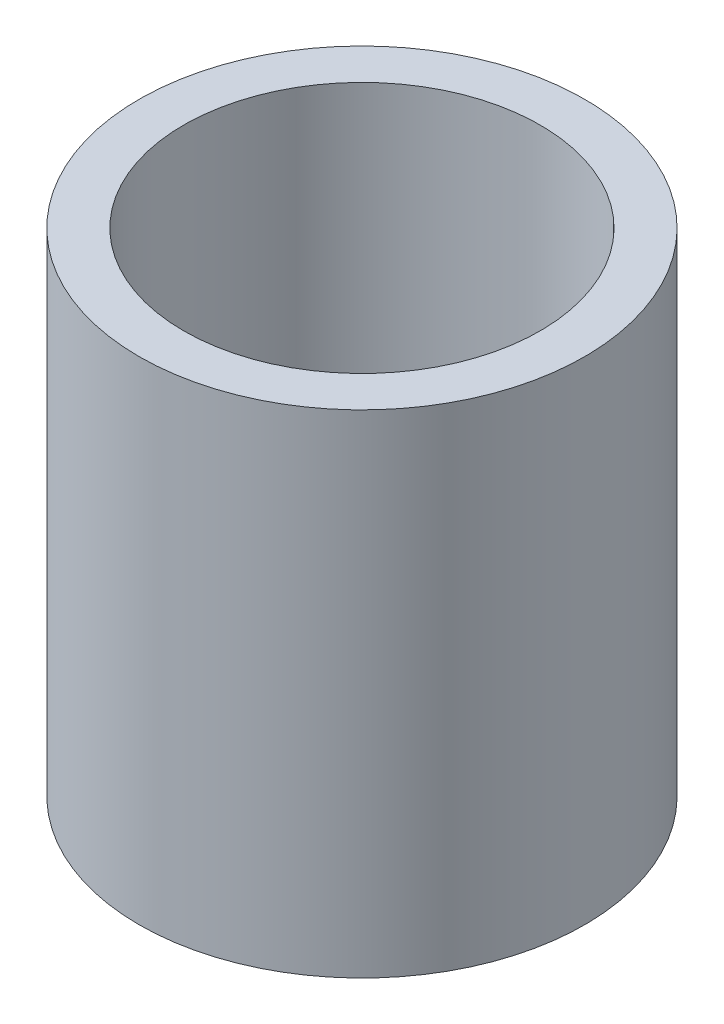
ISO-10303-21;
HEADER;
FILE_DESCRIPTION(('STEP AP214'),'2;1');
FILE_NAME('part.step','',(''),(''),'','','');
FILE_SCHEMA(('AUTOMOTIVE_DESIGN { 1 0 10303 214 1 1 1 1 }'));
ENDSEC;
DATA;
#1=APPLICATION_CONTEXT('core data for automotive mechanical design processes');
#2=APPLICATION_PROTOCOL_DEFINITION('international standard','automotive_design',2000,#1);
#3=PRODUCT_CONTEXT('',#1,'mechanical');
#4=PRODUCT('Part','Part','',(#3));
#5=PRODUCT_RELATED_PRODUCT_CATEGORY('part','',(#4));
#6=PRODUCT_DEFINITION_FORMATION('','',#4);
#7=PRODUCT_DEFINITION_CONTEXT('part definition',#1,'design');
#8=PRODUCT_DEFINITION('design','',#6,#7);
#9=PRODUCT_DEFINITION_SHAPE('','',#8);
#10=(LENGTH_UNIT() NAMED_UNIT(*) SI_UNIT(.MILLI.,.METRE.));
#11=(NAMED_UNIT(*) PLANE_ANGLE_UNIT() SI_UNIT($,.RADIAN.));
#12=(NAMED_UNIT(*) SI_UNIT($,.STERADIAN.) SOLID_ANGLE_UNIT());
#13=UNCERTAINTY_MEASURE_WITH_UNIT(LENGTH_MEASURE(1.E-05),#10,'distance_accuracy_value','');
#14=(GEOMETRIC_REPRESENTATION_CONTEXT(3) GLOBAL_UNCERTAINTY_ASSIGNED_CONTEXT((#13)) GLOBAL_UNIT_ASSIGNED_CONTEXT((#10,
#11,#12)) REPRESENTATION_CONTEXT('',''));
#15=CARTESIAN_POINT('',(0.,0.,0.));
#16=DIRECTION('',(0.,0.,1.));
#17=DIRECTION('',(1.,0.,0.));
#18=AXIS2_PLACEMENT_3D('',#15,#16,#17);
#19=CARTESIAN_POINT('',(0.,0.69,0.));
#20=DIRECTION('',(0.,1.,0.));
#21=DIRECTION('',(0.,0.,1.));
#22=AXIS2_PLACEMENT_3D('',#19,#20,#21);
#23=PLANE('',#22);
#24=CARTESIAN_POINT('',(0.,0.69,0.));
#25=DIRECTION('',(0.,1.,0.));
#26=DIRECTION('',(0.,0.,1.));
#27=AXIS2_PLACEMENT_3D('',#24,#25,#26);
#28=CIRCLE('',#27,0.625000000000001);
#29=CARTESIAN_POINT('',(0.,0.69,0.625000000000001));
#30=VERTEX_POINT('',#29);
#31=EDGE_CURVE('E10',#30,#30,#28,.T.);
#32=ORIENTED_EDGE('',*,*,#31,.T.);
#33=EDGE_LOOP('',(#32));
#34=FACE_BOUND('',#33,.T.);
#35=CARTESIAN_POINT('',(0.,0.69,0.));
#36=DIRECTION('',(0.,1.,0.));
#37=DIRECTION('',(0.,0.,1.));
#38=AXIS2_PLACEMENT_3D('',#35,#36,#37);
#39=CIRCLE('',#38,0.5);
#40=CARTESIAN_POINT('',(0.,0.69,0.5));
#41=VERTEX_POINT('',#40);
#42=EDGE_CURVE('E56',#41,#41,#39,.T.);
#43=ORIENTED_EDGE('',*,*,#42,.F.);
#44=EDGE_LOOP('',(#43));
#45=FACE_BOUND('',#44,.T.);
#46=ADVANCED_FACE('F43',(#34,#45),#23,.T.);
#47=CARTESIAN_POINT('',(0.,-0.69,0.));
#48=DIRECTION('',(0.,1.,0.));
#49=DIRECTION('',(0.,0.,1.));
#50=AXIS2_PLACEMENT_3D('',#47,#48,#49);
#51=PLANE('',#50);
#52=CARTESIAN_POINT('',(0.,-0.69,0.));
#53=DIRECTION('',(0.,1.,0.));
#54=DIRECTION('',(0.,0.,1.));
#55=AXIS2_PLACEMENT_3D('',#52,#53,#54);
#56=CIRCLE('',#55,0.625000000000001);
#57=CARTESIAN_POINT('',(0.,-0.69,0.625000000000001));
#58=VERTEX_POINT('',#57);
#59=EDGE_CURVE('E47',#58,#58,#56,.T.);
#60=ORIENTED_EDGE('',*,*,#59,.F.);
#61=EDGE_LOOP('',(#60));
#62=FACE_BOUND('',#61,.T.);
#63=CARTESIAN_POINT('',(0.,-0.69,0.));
#64=DIRECTION('',(0.,1.,0.));
#65=DIRECTION('',(0.,0.,1.));
#66=AXIS2_PLACEMENT_3D('',#63,#64,#65);
#67=CIRCLE('',#66,0.5);
#68=CARTESIAN_POINT('',(0.,-0.69,0.5));
#69=VERTEX_POINT('',#68);
#70=EDGE_CURVE('E58',#69,#69,#67,.T.);
#71=ORIENTED_EDGE('',*,*,#70,.T.);
#72=EDGE_LOOP('',(#71));
#73=FACE_BOUND('',#72,.T.);
#74=ADVANCED_FACE('F70',(#62,#73),#51,.F.);
#75=CARTESIAN_POINT('',(0.,0.69,0.));
#76=DIRECTION('',(0.,-1.,0.));
#77=DIRECTION('',(0.,0.,-1.));
#78=AXIS2_PLACEMENT_3D('',#75,#76,#77);
#79=CYLINDRICAL_SURFACE('',#78,0.625000000000001);
#80=ORIENTED_EDGE('',*,*,#31,.F.);
#81=EDGE_LOOP('',(#80));
#82=FACE_BOUND('',#81,.T.);
#83=ORIENTED_EDGE('',*,*,#59,.T.);
#84=EDGE_LOOP('',(#83));
#85=FACE_BOUND('',#84,.T.);
#86=ADVANCED_FACE('F45',(#82,#85),#79,.T.);
#87=CARTESIAN_POINT('',(0.,0.69,0.));
#88=DIRECTION('',(0.,-1.,0.));
#89=DIRECTION('',(0.,0.,-1.));
#90=AXIS2_PLACEMENT_3D('',#87,#88,#89);
#91=CYLINDRICAL_SURFACE('',#90,0.5);
#92=ORIENTED_EDGE('',*,*,#42,.T.);
#93=EDGE_LOOP('',(#92));
#94=FACE_BOUND('',#93,.T.);
#95=ORIENTED_EDGE('',*,*,#70,.F.);
#96=EDGE_LOOP('',(#95));
#97=FACE_BOUND('',#96,.T.);
#98=ADVANCED_FACE('F66',(#94,#97),#91,.F.);
#99=CLOSED_SHELL('',(#46,#74,#86,#98));
#100=MANIFOLD_SOLID_BREP('B2',#99);
#101=ADVANCED_BREP_SHAPE_REPRESENTATION('',(#18,#100),#14);
#102=SHAPE_DEFINITION_REPRESENTATION(#9,#101);
ENDSEC;
END-ISO-10303-21;
